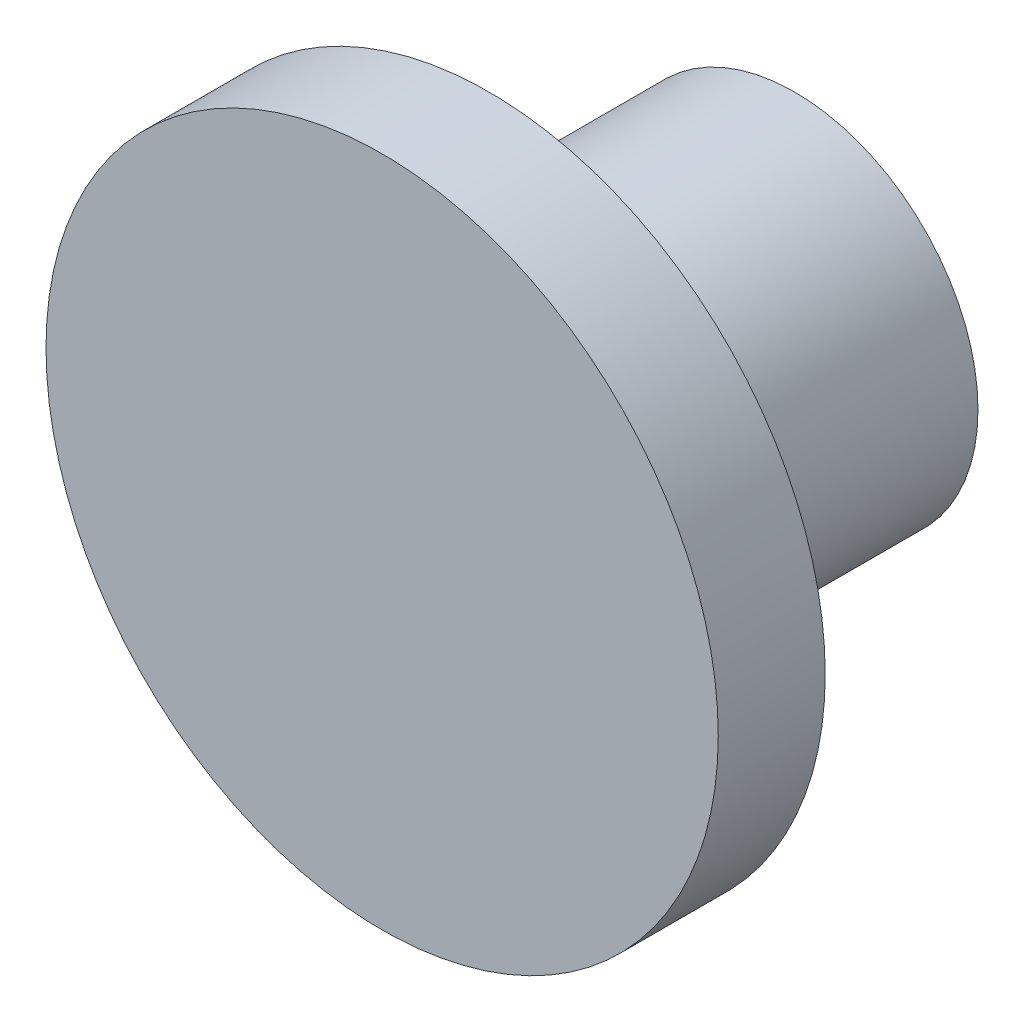
ISO-10303-21;
HEADER;
FILE_DESCRIPTION(('STEP AP214'),'2;1');
FILE_NAME('part.step','',(''),(''),'','','');
FILE_SCHEMA(('AUTOMOTIVE_DESIGN { 1 0 10303 214 1 1 1 1 }'));
ENDSEC;
DATA;
#1=APPLICATION_CONTEXT('core data for automotive mechanical design processes');
#2=APPLICATION_PROTOCOL_DEFINITION('international standard','automotive_design',2000,#1);
#3=PRODUCT_CONTEXT('',#1,'mechanical');
#4=PRODUCT('Part','Part','',(#3));
#5=PRODUCT_RELATED_PRODUCT_CATEGORY('part','',(#4));
#6=PRODUCT_DEFINITION_FORMATION('','',#4);
#7=PRODUCT_DEFINITION_CONTEXT('part definition',#1,'design');
#8=PRODUCT_DEFINITION('design','',#6,#7);
#9=PRODUCT_DEFINITION_SHAPE('','',#8);
#10=(LENGTH_UNIT() NAMED_UNIT(*) SI_UNIT(.MILLI.,.METRE.));
#11=(NAMED_UNIT(*) PLANE_ANGLE_UNIT() SI_UNIT($,.RADIAN.));
#12=(NAMED_UNIT(*) SI_UNIT($,.STERADIAN.) SOLID_ANGLE_UNIT());
#13=UNCERTAINTY_MEASURE_WITH_UNIT(LENGTH_MEASURE(1.E-05),#10,'distance_accuracy_value','');
#14=(GEOMETRIC_REPRESENTATION_CONTEXT(3) GLOBAL_UNCERTAINTY_ASSIGNED_CONTEXT((#13)) GLOBAL_UNIT_ASSIGNED_CONTEXT((#10,
#11,#12)) REPRESENTATION_CONTEXT('',''));
#15=CARTESIAN_POINT('',(0.,0.,0.));
#16=DIRECTION('',(0.,0.,1.));
#17=DIRECTION('',(1.,0.,0.));
#18=AXIS2_PLACEMENT_3D('',#15,#16,#17);
#19=CARTESIAN_POINT('',(0.,0.,-13.5));
#20=DIRECTION('',(0.,0.,1.));
#21=DIRECTION('',(1.,0.,0.));
#22=AXIS2_PLACEMENT_3D('',#19,#20,#21);
#23=PLANE('',#22);
#24=CARTESIAN_POINT('',(0.,0.,-13.5));
#25=DIRECTION('',(0.,0.,1.));
#26=DIRECTION('',(1.,0.,0.));
#27=AXIS2_PLACEMENT_3D('',#24,#25,#26);
#28=CIRCLE('',#27,6.);
#29=CARTESIAN_POINT('',(6.,0.,-13.5));
#30=VERTEX_POINT('',#29);
#31=EDGE_CURVE('E23',#30,#30,#28,.T.);
#32=ORIENTED_EDGE('',*,*,#31,.F.);
#33=EDGE_LOOP('',(#32));
#34=FACE_BOUND('',#33,.T.);
#35=ADVANCED_FACE('F15',(#34),#23,.F.);
#36=CARTESIAN_POINT('',(0.,0.,-13.5));
#37=DIRECTION('',(0.,0.,-1.));
#38=DIRECTION('',(1.,0.,0.));
#39=AXIS2_PLACEMENT_3D('',#36,#37,#38);
#40=CYLINDRICAL_SURFACE('',#39,6.);
#41=ORIENTED_EDGE('',*,*,#31,.T.);
#42=DIRECTION('',(0.,0.,1.));
#43=VECTOR('',#42,1.);
#44=CARTESIAN_POINT('',(6.,0.,-13.5));
#45=LINE('',#44,#43);
#46=CARTESIAN_POINT('',(6.,0.,-3.5));
#47=VERTEX_POINT('',#46);
#48=EDGE_CURVE('E9',#30,#47,#45,.T.);
#49=ORIENTED_EDGE('',*,*,#48,.T.);
#50=CARTESIAN_POINT('',(0.,0.,-3.5));
#51=DIRECTION('',(0.,0.,1.));
#52=DIRECTION('',(1.,0.,0.));
#53=AXIS2_PLACEMENT_3D('',#50,#51,#52);
#54=CIRCLE('',#53,6.);
#55=EDGE_CURVE('E58',#47,#47,#54,.T.);
#56=ORIENTED_EDGE('',*,*,#55,.F.);
#57=ORIENTED_EDGE('',*,*,#48,.F.);
#58=EDGE_LOOP('',(#41,#49,#56,#57));
#59=FACE_BOUND('',#58,.T.);
#60=ADVANCED_FACE('F68',(#59),#40,.T.);
#61=CARTESIAN_POINT('',(0.,0.,0.));
#62=DIRECTION('',(0.,0.,1.));
#63=DIRECTION('',(1.,0.,0.));
#64=AXIS2_PLACEMENT_3D('',#61,#62,#63);
#65=PLANE('',#64);
#66=CARTESIAN_POINT('',(0.,0.,0.));
#67=DIRECTION('',(0.,0.,1.));
#68=DIRECTION('',(1.,0.,0.));
#69=AXIS2_PLACEMENT_3D('',#66,#67,#68);
#70=CIRCLE('',#69,11.);
#71=CARTESIAN_POINT('',(11.,0.,0.));
#72=VERTEX_POINT('',#71);
#73=EDGE_CURVE('E53',#72,#72,#70,.T.);
#74=ORIENTED_EDGE('',*,*,#73,.T.);
#75=EDGE_LOOP('',(#74));
#76=FACE_BOUND('',#75,.T.);
#77=ADVANCED_FACE('F74',(#76),#65,.T.);
#78=CARTESIAN_POINT('',(0.,0.,-3.5));
#79=DIRECTION('',(0.,0.,1.));
#80=DIRECTION('',(1.,0.,0.));
#81=AXIS2_PLACEMENT_3D('',#78,#79,#80);
#82=PLANE('',#81);
#83=ORIENTED_EDGE('',*,*,#55,.T.);
#84=EDGE_LOOP('',(#83));
#85=FACE_BOUND('',#84,.T.);
#86=CARTESIAN_POINT('',(0.,0.,-3.5));
#87=DIRECTION('',(0.,0.,1.));
#88=DIRECTION('',(1.,0.,0.));
#89=AXIS2_PLACEMENT_3D('',#86,#87,#88);
#90=CIRCLE('',#89,11.);
#91=CARTESIAN_POINT('',(11.,0.,-3.5));
#92=VERTEX_POINT('',#91);
#93=EDGE_CURVE('E52',#92,#92,#90,.T.);
#94=ORIENTED_EDGE('',*,*,#93,.F.);
#95=EDGE_LOOP('',(#94));
#96=FACE_BOUND('',#95,.T.);
#97=ADVANCED_FACE('F78',(#85,#96),#82,.F.);
#98=CARTESIAN_POINT('',(0.,0.,-3.5));
#99=DIRECTION('',(0.,0.,-1.));
#100=DIRECTION('',(1.,0.,0.));
#101=AXIS2_PLACEMENT_3D('',#98,#99,#100);
#102=CYLINDRICAL_SURFACE('',#101,11.);
#103=ORIENTED_EDGE('',*,*,#93,.T.);
#104=DIRECTION('',(0.,0.,1.));
#105=VECTOR('',#104,1.);
#106=CARTESIAN_POINT('',(11.,0.,-3.5));
#107=LINE('',#106,#105);
#108=EDGE_CURVE('E49',#92,#72,#107,.T.);
#109=ORIENTED_EDGE('',*,*,#108,.T.);
#110=ORIENTED_EDGE('',*,*,#73,.F.);
#111=ORIENTED_EDGE('',*,*,#108,.F.);
#112=EDGE_LOOP('',(#103,#109,#110,#111));
#113=FACE_BOUND('',#112,.T.);
#114=ADVANCED_FACE('F51',(#113),#102,.T.);
#115=CLOSED_SHELL('',(#35,#60,#77,#97,#114));
#116=MANIFOLD_SOLID_BREP('B1',#115);
#117=ADVANCED_BREP_SHAPE_REPRESENTATION('',(#18,#116),#14);
#118=SHAPE_DEFINITION_REPRESENTATION(#9,#117);
ENDSEC;
END-ISO-10303-21;
